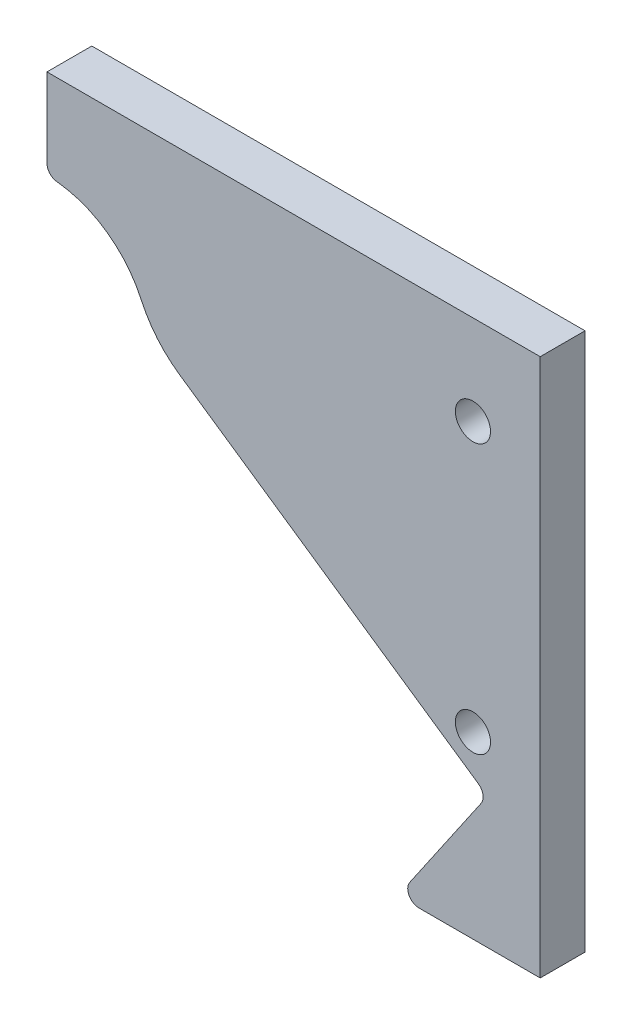
ISO-10303-21;
HEADER;
FILE_DESCRIPTION(('STEP AP214'),'2;1');
FILE_NAME('part.step','',(''),(''),'','','');
FILE_SCHEMA(('AUTOMOTIVE_DESIGN { 1 0 10303 214 1 1 1 1 }'));
ENDSEC;
DATA;
#1=APPLICATION_CONTEXT('core data for automotive mechanical design processes');
#2=APPLICATION_PROTOCOL_DEFINITION('international standard','automotive_design',2000,#1);
#3=PRODUCT_CONTEXT('',#1,'mechanical');
#4=PRODUCT('Part','Part','',(#3));
#5=PRODUCT_RELATED_PRODUCT_CATEGORY('part','',(#4));
#6=PRODUCT_DEFINITION_FORMATION('','',#4);
#7=PRODUCT_DEFINITION_CONTEXT('part definition',#1,'design');
#8=PRODUCT_DEFINITION('design','',#6,#7);
#9=PRODUCT_DEFINITION_SHAPE('','',#8);
#10=(LENGTH_UNIT() NAMED_UNIT(*) SI_UNIT(.MILLI.,.METRE.));
#11=(NAMED_UNIT(*) PLANE_ANGLE_UNIT() SI_UNIT($,.RADIAN.));
#12=(NAMED_UNIT(*) SI_UNIT($,.STERADIAN.) SOLID_ANGLE_UNIT());
#13=UNCERTAINTY_MEASURE_WITH_UNIT(LENGTH_MEASURE(1.E-05),#10,'distance_accuracy_value','');
#14=(GEOMETRIC_REPRESENTATION_CONTEXT(3) GLOBAL_UNCERTAINTY_ASSIGNED_CONTEXT((#13)) GLOBAL_UNIT_ASSIGNED_CONTEXT((#10,
#11,#12)) REPRESENTATION_CONTEXT('',''));
#15=CARTESIAN_POINT('',(0.,0.,0.));
#16=DIRECTION('',(0.,0.,1.));
#17=DIRECTION('',(1.,0.,0.));
#18=AXIS2_PLACEMENT_3D('',#15,#16,#17);
#19=CARTESIAN_POINT('',(27.7878622659884,12.7088972427335,3.175));
#20=DIRECTION('',(0.,0.,-1.));
#21=DIRECTION('',(-1.,0.,0.));
#22=AXIS2_PLACEMENT_3D('',#19,#20,#21);
#23=CYLINDRICAL_SURFACE('',#22,15.8749999999984);
#24=CARTESIAN_POINT('',(27.7878622659884,12.7088972427335,-3.175));
#25=DIRECTION('',(0.,0.,1.));
#26=DIRECTION('',(1.,0.,0.));
#27=AXIS2_PLACEMENT_3D('',#24,#25,#26);
#28=CIRCLE('',#27,15.8749999999984);
#29=CARTESIAN_POINT('',(18.8121538652358,-0.385081667613314,-3.175));
#30=VERTEX_POINT('',#29);
#31=CARTESIAN_POINT('',(13.351109218406,6.10618670515418,-3.175));
#32=VERTEX_POINT('',#31);
#33=EDGE_CURVE('E141',#30,#32,#28,.F.);
#34=ORIENTED_EDGE('',*,*,#33,.F.);
#35=DIRECTION('',(0.,0.,-1.));
#36=VECTOR('',#35,1.);
#37=CARTESIAN_POINT('',(18.8121538652358,-0.385081667613314,3.175));
#38=LINE('',#37,#36);
#39=CARTESIAN_POINT('',(18.8121538652358,-0.385081667613314,3.175));
#40=VERTEX_POINT('',#39);
#41=EDGE_CURVE('E128',#40,#30,#38,.T.);
#42=ORIENTED_EDGE('',*,*,#41,.F.);
#43=CARTESIAN_POINT('',(27.7878622659884,12.7088972427335,3.175));
#44=DIRECTION('',(0.,0.,1.));
#45=DIRECTION('',(1.,0.,0.));
#46=AXIS2_PLACEMENT_3D('',#43,#44,#45);
#47=CIRCLE('',#46,15.8749999999984);
#48=CARTESIAN_POINT('',(13.351109218406,6.10618670515418,3.175));
#49=VERTEX_POINT('',#48);
#50=EDGE_CURVE('E135',#40,#49,#47,.F.);
#51=ORIENTED_EDGE('',*,*,#50,.T.);
#52=DIRECTION('',(0.,0.,-1.));
#53=VECTOR('',#52,1.);
#54=CARTESIAN_POINT('',(13.351109218406,6.10618670515418,3.175));
#55=LINE('',#54,#53);
#56=EDGE_CURVE('E185',#49,#32,#55,.T.);
#57=ORIENTED_EDGE('',*,*,#56,.T.);
#58=EDGE_LOOP('',(#34,#42,#51,#57));
#59=FACE_BOUND('',#58,.T.);
#60=ADVANCED_FACE('F41',(#59),#23,.T.);
#61=CARTESIAN_POINT('',(5.83421046048887,8.51108629172496,3.175));
#62=DIRECTION('',(-0.565398954378175,-0.82481756915579,0.));
#63=DIRECTION('',(0.82481756915579,-0.565398954378175,0.));
#64=AXIS2_PLACEMENT_3D('',#61,#62,#63);
#65=PLANE('',#64);
#66=DIRECTION('',(-0.82481756915579,0.565398954378175,0.));
#67=VECTOR('',#66,1.);
#68=CARTESIAN_POINT('',(5.83421046048887,8.51108629172496,-3.175));
#69=LINE('',#68,#67);
#70=CARTESIAN_POINT('',(61.07951778784,-29.358668385246,-3.175));
#71=VERTEX_POINT('',#70);
#72=EDGE_CURVE('E188',#71,#30,#69,.T.);
#73=ORIENTED_EDGE('',*,*,#72,.F.);
#74=DIRECTION('',(0.,0.,-1.));
#75=VECTOR('',#74,1.);
#76=CARTESIAN_POINT('',(61.07951778784,-29.358668385246,3.175));
#77=LINE('',#76,#75);
#78=CARTESIAN_POINT('',(61.07951778784,-29.358668385246,3.175));
#79=VERTEX_POINT('',#78);
#80=EDGE_CURVE('E131',#71,#79,#77,.F.);
#81=ORIENTED_EDGE('',*,*,#80,.T.);
#82=DIRECTION('',(-0.82481756915579,0.565398954378175,0.));
#83=VECTOR('',#82,1.);
#84=CARTESIAN_POINT('',(5.83421046048887,8.51108629172496,3.175));
#85=LINE('',#84,#83);
#86=EDGE_CURVE('E124',#79,#40,#85,.T.);
#87=ORIENTED_EDGE('',*,*,#86,.T.);
#88=ORIENTED_EDGE('',*,*,#41,.T.);
#89=EDGE_LOOP('',(#73,#81,#87,#88));
#90=FACE_BOUND('',#89,.T.);
#91=ADVANCED_FACE('F127',(#90),#65,.T.);
#92=CARTESIAN_POINT('',(56.5547052183858,-38.7673255170464,3.175));
#93=DIRECTION('',(-0.824817569155788,0.565398954378177,0.));
#94=DIRECTION('',(-0.565398954378177,-0.824817569155788,0.));
#95=AXIS2_PLACEMENT_3D('',#92,#93,#94);
#96=PLANE('',#95);
#97=DIRECTION('',(0.565398954378177,0.824817569155788,0.));
#98=VECTOR('',#97,1.);
#99=CARTESIAN_POINT('',(56.5547052183858,-38.7673255170464,-3.175));
#100=LINE('',#99,#98);
#101=CARTESIAN_POINT('',(51.3680592640993,-46.3337291599242,-3.175));
#102=VERTEX_POINT('',#101);
#103=CARTESIAN_POINT('',(61.4913448387995,-31.5656371163561,-3.175));
#104=VERTEX_POINT('',#103);
#105=EDGE_CURVE('E191',#102,#104,#100,.T.);
#106=ORIENTED_EDGE('',*,*,#105,.F.);
#107=DIRECTION('',(0.,0.,-1.));
#108=VECTOR('',#107,1.);
#109=CARTESIAN_POINT('',(51.3680592640993,-46.3337291599242,3.175));
#110=LINE('',#109,#108);
#111=CARTESIAN_POINT('',(51.3680592640993,-46.3337291599242,3.175));
#112=VERTEX_POINT('',#111);
#113=EDGE_CURVE('E253',#102,#112,#110,.F.);
#114=ORIENTED_EDGE('',*,*,#113,.T.);
#115=DIRECTION('',(0.565398954378177,0.824817569155788,0.));
#116=VECTOR('',#115,1.);
#117=CARTESIAN_POINT('',(56.5547052183858,-38.7673255170464,3.175));
#118=LINE('',#117,#116);
#119=CARTESIAN_POINT('',(61.4913448387995,-31.5656371163561,3.175));
#120=VERTEX_POINT('',#119);
#121=EDGE_CURVE('E134',#112,#120,#118,.T.);
#122=ORIENTED_EDGE('',*,*,#121,.T.);
#123=DIRECTION('',(0.,0.,-1.));
#124=VECTOR('',#123,1.);
#125=CARTESIAN_POINT('',(61.4913448387995,-31.5656371163561,-3.175));
#126=LINE('',#125,#124);
#127=EDGE_CURVE('E249',#120,#104,#126,.T.);
#128=ORIENTED_EDGE('',*,*,#127,.T.);
#129=EDGE_LOOP('',(#106,#114,#122,#128));
#130=FACE_BOUND('',#129,.T.);
#131=ADVANCED_FACE('F265',(#130),#96,.T.);
#132=CARTESIAN_POINT('',(0.,-48.8187999999995,3.175));
#133=DIRECTION('',(0.,-1.,0.));
#134=DIRECTION('',(0.,0.,-1.));
#135=AXIS2_PLACEMENT_3D('',#132,#133,#134);
#136=PLANE('',#135);
#137=DIRECTION('',(-1.,0.,0.));
#138=VECTOR('',#137,1.);
#139=CARTESIAN_POINT('',(0.,-48.8187999999995,3.175));
#140=LINE('',#139,#138);
#141=CARTESIAN_POINT('',(69.85,-48.8187999999995,3.175));
#142=VERTEX_POINT('',#141);
#143=CARTESIAN_POINT('',(52.6774571551341,-48.8187999999995,3.175));
#144=VERTEX_POINT('',#143);
#145=EDGE_CURVE('E161',#142,#144,#140,.T.);
#146=ORIENTED_EDGE('',*,*,#145,.T.);
#147=DIRECTION('',(0.,0.,-1.));
#148=VECTOR('',#147,1.);
#149=CARTESIAN_POINT('',(52.6774571551341,-48.8187999999995,3.175));
#150=LINE('',#149,#148);
#151=CARTESIAN_POINT('',(52.6774571551341,-48.8187999999995,-3.175));
#152=VERTEX_POINT('',#151);
#153=EDGE_CURVE('E245',#144,#152,#150,.T.);
#154=ORIENTED_EDGE('',*,*,#153,.T.);
#155=DIRECTION('',(-1.,0.,0.));
#156=VECTOR('',#155,1.);
#157=CARTESIAN_POINT('',(0.,-48.8187999999995,-3.175));
#158=LINE('',#157,#156);
#159=CARTESIAN_POINT('',(69.85,-48.8187999999995,-3.175));
#160=VERTEX_POINT('',#159);
#161=EDGE_CURVE('E195',#160,#152,#158,.T.);
#162=ORIENTED_EDGE('',*,*,#161,.F.);
#163=DIRECTION('',(0.,0.,-1.));
#164=VECTOR('',#163,1.);
#165=CARTESIAN_POINT('',(69.85,-48.8187999999995,3.175));
#166=LINE('',#165,#164);
#167=EDGE_CURVE('E144',#142,#160,#166,.T.);
#168=ORIENTED_EDGE('',*,*,#167,.F.);
#169=EDGE_LOOP('',(#146,#154,#162,#168));
#170=FACE_BOUND('',#169,.T.);
#171=ADVANCED_FACE('F272',(#170),#136,.T.);
#172=CARTESIAN_POINT('',(69.85,0.,3.175));
#173=DIRECTION('',(1.,0.,0.));
#174=DIRECTION('',(0.,1.,0.));
#175=AXIS2_PLACEMENT_3D('',#172,#173,#174);
#176=PLANE('',#175);
#177=DIRECTION('',(0.,-1.,0.));
#178=VECTOR('',#177,1.);
#179=CARTESIAN_POINT('',(69.85,0.,-3.175));
#180=LINE('',#179,#178);
#181=CARTESIAN_POINT('',(69.85,27.3812000000005,-3.175));
#182=VERTEX_POINT('',#181);
#183=EDGE_CURVE('E199',#182,#160,#180,.T.);
#184=ORIENTED_EDGE('',*,*,#183,.F.);
#185=DIRECTION('',(0.,0.,-1.));
#186=VECTOR('',#185,1.);
#187=CARTESIAN_POINT('',(69.85,27.3812000000005,3.175));
#188=LINE('',#187,#186);
#189=CARTESIAN_POINT('',(69.85,27.3812000000005,3.175));
#190=VERTEX_POINT('',#189);
#191=EDGE_CURVE('E223',#190,#182,#188,.T.);
#192=ORIENTED_EDGE('',*,*,#191,.F.);
#193=DIRECTION('',(0.,-1.,0.));
#194=VECTOR('',#193,1.);
#195=CARTESIAN_POINT('',(69.85,0.,3.175));
#196=LINE('',#195,#194);
#197=EDGE_CURVE('E164',#190,#142,#196,.T.);
#198=ORIENTED_EDGE('',*,*,#197,.T.);
#199=ORIENTED_EDGE('',*,*,#167,.T.);
#200=EDGE_LOOP('',(#184,#192,#198,#199));
#201=FACE_BOUND('',#200,.T.);
#202=ADVANCED_FACE('F277',(#201),#176,.T.);
#203=CARTESIAN_POINT('',(0.,27.3812000000005,3.175));
#204=DIRECTION('',(0.,1.,0.));
#205=DIRECTION('',(0.,0.,1.));
#206=AXIS2_PLACEMENT_3D('',#203,#204,#205);
#207=PLANE('',#206);
#208=DIRECTION('',(1.,0.,0.));
#209=VECTOR('',#208,1.);
#210=CARTESIAN_POINT('',(0.,27.3812000000005,-3.175));
#211=LINE('',#210,#209);
#212=CARTESIAN_POINT('',(0.,27.3812000000005,-3.175));
#213=VERTEX_POINT('',#212);
#214=EDGE_CURVE('E203',#213,#182,#211,.T.);
#215=ORIENTED_EDGE('',*,*,#214,.F.);
#216=DIRECTION('',(0.,0.,-1.));
#217=VECTOR('',#216,1.);
#218=CARTESIAN_POINT('',(0.,27.3812000000005,3.175));
#219=LINE('',#218,#217);
#220=CARTESIAN_POINT('',(0.,27.3812000000005,3.175));
#221=VERTEX_POINT('',#220);
#222=EDGE_CURVE('E220',#221,#213,#219,.T.);
#223=ORIENTED_EDGE('',*,*,#222,.F.);
#224=DIRECTION('',(1.,0.,0.));
#225=VECTOR('',#224,1.);
#226=CARTESIAN_POINT('',(0.,27.3812000000005,3.175));
#227=LINE('',#226,#225);
#228=EDGE_CURVE('E168',#221,#190,#227,.T.);
#229=ORIENTED_EDGE('',*,*,#228,.T.);
#230=ORIENTED_EDGE('',*,*,#191,.T.);
#231=EDGE_LOOP('',(#215,#223,#229,#230));
#232=FACE_BOUND('',#231,.T.);
#233=ADVANCED_FACE('F281',(#232),#207,.T.);
#234=CARTESIAN_POINT('',(0.,0.,3.175));
#235=DIRECTION('',(1.,0.,0.));
#236=DIRECTION('',(0.,1.,0.));
#237=AXIS2_PLACEMENT_3D('',#234,#235,#236);
#238=PLANE('',#237);
#239=DIRECTION('',(0.,-1.,0.));
#240=VECTOR('',#239,1.);
#241=CARTESIAN_POINT('',(0.,0.,-3.175));
#242=LINE('',#241,#240);
#243=CARTESIAN_POINT('',(0.,16.1910606026908,-3.175));
#244=VERTEX_POINT('',#243);
#245=EDGE_CURVE('E207',#213,#244,#242,.T.);
#246=ORIENTED_EDGE('',*,*,#245,.T.);
#247=DIRECTION('',(0.,0.,1.));
#248=VECTOR('',#247,1.);
#249=CARTESIAN_POINT('',(0.,16.1910606026908,3.175));
#250=LINE('',#249,#248);
#251=CARTESIAN_POINT('',(0.,16.1910606026908,3.175));
#252=VERTEX_POINT('',#251);
#253=EDGE_CURVE('E237',#244,#252,#250,.T.);
#254=ORIENTED_EDGE('',*,*,#253,.T.);
#255=DIRECTION('',(0.,-1.,0.));
#256=VECTOR('',#255,1.);
#257=CARTESIAN_POINT('',(0.,0.,3.175));
#258=LINE('',#257,#256);
#259=EDGE_CURVE('E172',#221,#252,#258,.T.);
#260=ORIENTED_EDGE('',*,*,#259,.F.);
#261=ORIENTED_EDGE('',*,*,#222,.T.);
#262=EDGE_LOOP('',(#246,#254,#260,#261));
#263=FACE_BOUND('',#262,.T.);
#264=ADVANCED_FACE('F284',(#263),#238,.F.);
#265=CARTESIAN_POINT('',(60.325,-23.4187999999996,3.175));
#266=DIRECTION('',(0.,0.,-1.));
#267=DIRECTION('',(-1.,0.,0.));
#268=AXIS2_PLACEMENT_3D('',#265,#266,#267);
#269=CYLINDRICAL_SURFACE('',#268,2.48920000000001);
#270=CARTESIAN_POINT('',(60.325,-23.4187999999996,3.175));
#271=DIRECTION('',(0.,0.,1.));
#272=DIRECTION('',(1.,0.,0.));
#273=AXIS2_PLACEMENT_3D('',#270,#271,#272);
#274=CIRCLE('',#273,2.48920000000001);
#275=CARTESIAN_POINT('',(62.8142,-23.4187999999996,3.175));
#276=VERTEX_POINT('',#275);
#277=EDGE_CURVE('E177',#276,#276,#274,.T.);
#278=ORIENTED_EDGE('',*,*,#277,.T.);
#279=EDGE_LOOP('',(#278));
#280=FACE_BOUND('',#279,.T.);
#281=CARTESIAN_POINT('',(60.325,-23.4187999999996,-3.175));
#282=DIRECTION('',(0.,0.,1.));
#283=DIRECTION('',(1.,0.,0.));
#284=AXIS2_PLACEMENT_3D('',#281,#282,#283);
#285=CIRCLE('',#284,2.48920000000001);
#286=CARTESIAN_POINT('',(62.8142,-23.4187999999996,-3.175));
#287=VERTEX_POINT('',#286);
#288=EDGE_CURVE('E156',#287,#287,#285,.T.);
#289=ORIENTED_EDGE('',*,*,#288,.F.);
#290=EDGE_LOOP('',(#289));
#291=FACE_BOUND('',#290,.T.);
#292=ADVANCED_FACE('F295',(#280,#291),#269,.F.);
#293=CARTESIAN_POINT('',(0.,0.,3.175));
#294=DIRECTION('',(0.,0.,-1.));
#295=DIRECTION('',(-1.,0.,0.));
#296=AXIS2_PLACEMENT_3D('',#293,#294,#295);
#297=CYLINDRICAL_SURFACE('',#296,14.6812000000002);
#298=CARTESIAN_POINT('',(0.,0.,3.175));
#299=DIRECTION('',(0.,0.,1.));
#300=DIRECTION('',(1.,0.,0.));
#301=AXIS2_PLACEMENT_3D('',#298,#299,#300);
#302=CIRCLE('',#301,14.6812000000002);
#303=CARTESIAN_POINT('',(1.43259172521468,14.6111366562925,3.175));
#304=VERTEX_POINT('',#303);
#305=EDGE_CURVE('E150',#49,#304,#302,.T.);
#306=ORIENTED_EDGE('',*,*,#305,.T.);
#307=DIRECTION('',(0.,0.,-1.));
#308=VECTOR('',#307,1.);
#309=CARTESIAN_POINT('',(1.43259172521468,14.6111366562925,3.175));
#310=LINE('',#309,#308);
#311=CARTESIAN_POINT('',(1.43259172521468,14.6111366562925,-3.175));
#312=VERTEX_POINT('',#311);
#313=EDGE_CURVE('E143',#304,#312,#310,.T.);
#314=ORIENTED_EDGE('',*,*,#313,.T.);
#315=CARTESIAN_POINT('',(0.,0.,-3.175));
#316=DIRECTION('',(0.,0.,1.));
#317=DIRECTION('',(1.,0.,0.));
#318=AXIS2_PLACEMENT_3D('',#315,#316,#317);
#319=CIRCLE('',#318,14.6812000000002);
#320=EDGE_CURVE('E211',#32,#312,#319,.T.);
#321=ORIENTED_EDGE('',*,*,#320,.F.);
#322=ORIENTED_EDGE('',*,*,#56,.F.);
#323=EDGE_LOOP('',(#306,#314,#321,#322));
#324=FACE_BOUND('',#323,.T.);
#325=ADVANCED_FACE('F292',(#324),#297,.F.);
#326=CARTESIAN_POINT('',(60.325,14.6812000000005,3.175));
#327=DIRECTION('',(0.,0.,-1.));
#328=DIRECTION('',(-1.,0.,0.));
#329=AXIS2_PLACEMENT_3D('',#326,#327,#328);
#330=CYLINDRICAL_SURFACE('',#329,2.4892);
#331=CARTESIAN_POINT('',(60.325,14.6812000000005,3.175));
#332=DIRECTION('',(0.,0.,1.));
#333=DIRECTION('',(1.,0.,0.));
#334=AXIS2_PLACEMENT_3D('',#331,#332,#333);
#335=CIRCLE('',#334,2.4892);
#336=CARTESIAN_POINT('',(62.8142,14.6812000000005,3.175));
#337=VERTEX_POINT('',#336);
#338=EDGE_CURVE('E181',#337,#337,#335,.T.);
#339=ORIENTED_EDGE('',*,*,#338,.T.);
#340=EDGE_LOOP('',(#339));
#341=FACE_BOUND('',#340,.T.);
#342=CARTESIAN_POINT('',(60.325,14.6812000000005,-3.175));
#343=DIRECTION('',(0.,0.,1.));
#344=DIRECTION('',(1.,0.,0.));
#345=AXIS2_PLACEMENT_3D('',#342,#343,#344);
#346=CIRCLE('',#345,2.4892);
#347=CARTESIAN_POINT('',(62.8142,14.6812000000005,-3.175));
#348=VERTEX_POINT('',#347);
#349=EDGE_CURVE('E152',#348,#348,#346,.T.);
#350=ORIENTED_EDGE('',*,*,#349,.F.);
#351=EDGE_LOOP('',(#350));
#352=FACE_BOUND('',#351,.T.);
#353=ADVANCED_FACE('F294',(#341,#352),#330,.F.);
#354=CARTESIAN_POINT('',(0.,0.,3.175));
#355=DIRECTION('',(0.,0.,1.));
#356=DIRECTION('',(1.,0.,0.));
#357=AXIS2_PLACEMENT_3D('',#354,#355,#356);
#358=PLANE('',#357);
#359=ORIENTED_EDGE('',*,*,#259,.T.);
#360=CARTESIAN_POINT('',(1.5875,16.1910606026908,3.175));
#361=DIRECTION('',(0.,0.,1.));
#362=DIRECTION('',(1.,0.,0.));
#363=AXIS2_PLACEMENT_3D('',#360,#361,#362);
#364=CIRCLE('',#363,1.5875);
#365=EDGE_CURVE('E242',#252,#304,#364,.T.);
#366=ORIENTED_EDGE('',*,*,#365,.T.);
#367=ORIENTED_EDGE('',*,*,#305,.F.);
#368=ORIENTED_EDGE('',*,*,#50,.F.);
#369=ORIENTED_EDGE('',*,*,#86,.F.);
#370=CARTESIAN_POINT('',(60.1819469477646,-30.6680662762808,3.175));
#371=DIRECTION('',(0.,0.,1.));
#372=DIRECTION('',(1.,0.,0.));
#373=AXIS2_PLACEMENT_3D('',#370,#371,#372);
#374=CIRCLE('',#373,1.5875);
#375=EDGE_CURVE('E11',#79,#120,#374,.F.);
#376=ORIENTED_EDGE('',*,*,#375,.T.);
#377=ORIENTED_EDGE('',*,*,#121,.F.);
#378=CARTESIAN_POINT('',(52.6774571551341,-47.2312999999995,3.175));
#379=DIRECTION('',(0.,0.,1.));
#380=DIRECTION('',(1.,0.,0.));
#381=AXIS2_PLACEMENT_3D('',#378,#379,#380);
#382=CIRCLE('',#381,1.5875);
#383=EDGE_CURVE('E57',#112,#144,#382,.T.);
#384=ORIENTED_EDGE('',*,*,#383,.T.);
#385=ORIENTED_EDGE('',*,*,#145,.F.);
#386=ORIENTED_EDGE('',*,*,#197,.F.);
#387=ORIENTED_EDGE('',*,*,#228,.F.);
#388=EDGE_LOOP('',(#359,#366,#367,#368,#369,#376,#377,#384,#385,#386,#387));
#389=FACE_BOUND('',#388,.T.);
#390=ORIENTED_EDGE('',*,*,#277,.F.);
#391=EDGE_LOOP('',(#390));
#392=FACE_BOUND('',#391,.T.);
#393=ORIENTED_EDGE('',*,*,#338,.F.);
#394=EDGE_LOOP('',(#393));
#395=FACE_BOUND('',#394,.T.);
#396=ADVANCED_FACE('F147',(#389,#392,#395),#358,.T.);
#397=CARTESIAN_POINT('',(0.,0.,-3.175));
#398=DIRECTION('',(0.,0.,1.));
#399=DIRECTION('',(1.,0.,0.));
#400=AXIS2_PLACEMENT_3D('',#397,#398,#399);
#401=PLANE('',#400);
#402=ORIENTED_EDGE('',*,*,#320,.T.);
#403=CARTESIAN_POINT('',(1.5875,16.1910606026908,-3.175));
#404=DIRECTION('',(0.,0.,1.));
#405=DIRECTION('',(1.,0.,0.));
#406=AXIS2_PLACEMENT_3D('',#403,#404,#405);
#407=CIRCLE('',#406,1.5875);
#408=EDGE_CURVE('E234',#312,#244,#407,.F.);
#409=ORIENTED_EDGE('',*,*,#408,.T.);
#410=ORIENTED_EDGE('',*,*,#245,.F.);
#411=ORIENTED_EDGE('',*,*,#214,.T.);
#412=ORIENTED_EDGE('',*,*,#183,.T.);
#413=ORIENTED_EDGE('',*,*,#161,.T.);
#414=CARTESIAN_POINT('',(52.6774571551341,-47.2312999999995,-3.175));
#415=DIRECTION('',(0.,0.,1.));
#416=DIRECTION('',(1.,0.,0.));
#417=AXIS2_PLACEMENT_3D('',#414,#415,#416);
#418=CIRCLE('',#417,1.5875);
#419=EDGE_CURVE('E231',#152,#102,#418,.F.);
#420=ORIENTED_EDGE('',*,*,#419,.T.);
#421=ORIENTED_EDGE('',*,*,#105,.T.);
#422=CARTESIAN_POINT('',(60.1819469477646,-30.6680662762808,-3.175));
#423=DIRECTION('',(0.,0.,1.));
#424=DIRECTION('',(1.,0.,0.));
#425=AXIS2_PLACEMENT_3D('',#422,#423,#424);
#426=CIRCLE('',#425,1.5875);
#427=EDGE_CURVE('E50',#104,#71,#426,.T.);
#428=ORIENTED_EDGE('',*,*,#427,.T.);
#429=ORIENTED_EDGE('',*,*,#72,.T.);
#430=ORIENTED_EDGE('',*,*,#33,.T.);
#431=EDGE_LOOP('',(#402,#409,#410,#411,#412,#413,#420,#421,#428,#429,#430));
#432=FACE_BOUND('',#431,.T.);
#433=ORIENTED_EDGE('',*,*,#288,.T.);
#434=EDGE_LOOP('',(#433));
#435=FACE_BOUND('',#434,.T.);
#436=ORIENTED_EDGE('',*,*,#349,.T.);
#437=EDGE_LOOP('',(#436));
#438=FACE_BOUND('',#437,.T.);
#439=ADVANCED_FACE('F259',(#432,#435,#438),#401,.F.);
#440=CARTESIAN_POINT('',(1.5875,16.1910606026908,3.175));
#441=DIRECTION('',(0.,0.,-1.));
#442=DIRECTION('',(-1.,0.,0.));
#443=AXIS2_PLACEMENT_3D('',#440,#441,#442);
#444=CYLINDRICAL_SURFACE('',#443,1.5875);
#445=ORIENTED_EDGE('',*,*,#365,.F.);
#446=ORIENTED_EDGE('',*,*,#253,.F.);
#447=ORIENTED_EDGE('',*,*,#408,.F.);
#448=ORIENTED_EDGE('',*,*,#313,.F.);
#449=EDGE_LOOP('',(#445,#446,#447,#448));
#450=FACE_BOUND('',#449,.T.);
#451=ADVANCED_FACE('F289',(#450),#444,.T.);
#452=CARTESIAN_POINT('',(52.6774571551341,-47.2312999999995,3.175));
#453=DIRECTION('',(0.,0.,-1.));
#454=DIRECTION('',(-1.,0.,0.));
#455=AXIS2_PLACEMENT_3D('',#452,#453,#454);
#456=CYLINDRICAL_SURFACE('',#455,1.5875);
#457=ORIENTED_EDGE('',*,*,#383,.F.);
#458=ORIENTED_EDGE('',*,*,#113,.F.);
#459=ORIENTED_EDGE('',*,*,#419,.F.);
#460=ORIENTED_EDGE('',*,*,#153,.F.);
#461=EDGE_LOOP('',(#457,#458,#459,#460));
#462=FACE_BOUND('',#461,.T.);
#463=ADVANCED_FACE('F269',(#462),#456,.T.);
#464=CARTESIAN_POINT('',(60.1819469477646,-30.6680662762808,3.175));
#465=DIRECTION('',(0.,0.,1.));
#466=DIRECTION('',(1.,0.,0.));
#467=AXIS2_PLACEMENT_3D('',#464,#465,#466);
#468=CYLINDRICAL_SURFACE('',#467,1.5875);
#469=ORIENTED_EDGE('',*,*,#375,.F.);
#470=ORIENTED_EDGE('',*,*,#80,.F.);
#471=ORIENTED_EDGE('',*,*,#427,.F.);
#472=ORIENTED_EDGE('',*,*,#127,.F.);
#473=EDGE_LOOP('',(#469,#470,#471,#472));
#474=FACE_BOUND('',#473,.T.);
#475=ADVANCED_FACE('F43',(#474),#468,.F.);
#476=CLOSED_SHELL('',(#60,#91,#131,#171,#202,#233,#264,#292,#325,#353,#396,#439,#451,#463,#475));
#477=MANIFOLD_SOLID_BREP('B2',#476);
#478=ADVANCED_BREP_SHAPE_REPRESENTATION('',(#18,#477),#14);
#479=SHAPE_DEFINITION_REPRESENTATION(#9,#478);
ENDSEC;
END-ISO-10303-21;
